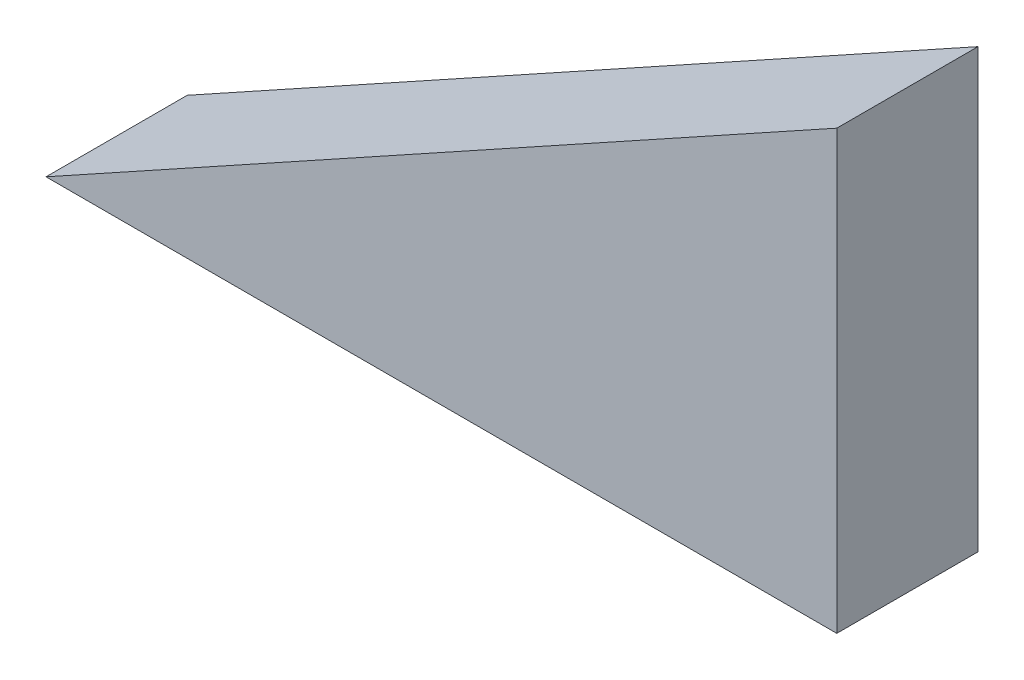
ISO-10303-21;
HEADER;
FILE_DESCRIPTION(('STEP AP214'),'2;1');
FILE_NAME('part.step','',(''),(''),'','','');
FILE_SCHEMA(('AUTOMOTIVE_DESIGN { 1 0 10303 214 1 1 1 1 }'));
ENDSEC;
DATA;
#1=APPLICATION_CONTEXT('core data for automotive mechanical design processes');
#2=APPLICATION_PROTOCOL_DEFINITION('international standard','automotive_design',2000,#1);
#3=PRODUCT_CONTEXT('',#1,'mechanical');
#4=PRODUCT('Part','Part','',(#3));
#5=PRODUCT_RELATED_PRODUCT_CATEGORY('part','',(#4));
#6=PRODUCT_DEFINITION_FORMATION('','',#4);
#7=PRODUCT_DEFINITION_CONTEXT('part definition',#1,'design');
#8=PRODUCT_DEFINITION('design','',#6,#7);
#9=PRODUCT_DEFINITION_SHAPE('','',#8);
#10=(LENGTH_UNIT() NAMED_UNIT(*) SI_UNIT(.MILLI.,.METRE.));
#11=(NAMED_UNIT(*) PLANE_ANGLE_UNIT() SI_UNIT($,.RADIAN.));
#12=(NAMED_UNIT(*) SI_UNIT($,.STERADIAN.) SOLID_ANGLE_UNIT());
#13=UNCERTAINTY_MEASURE_WITH_UNIT(LENGTH_MEASURE(1.E-05),#10,'distance_accuracy_value','');
#14=(GEOMETRIC_REPRESENTATION_CONTEXT(3) GLOBAL_UNCERTAINTY_ASSIGNED_CONTEXT((#13)) GLOBAL_UNIT_ASSIGNED_CONTEXT((#10,
#11,#12)) REPRESENTATION_CONTEXT('',''));
#15=CARTESIAN_POINT('',(0.,0.,0.));
#16=DIRECTION('',(0.,0.,1.));
#17=DIRECTION('',(1.,0.,0.));
#18=AXIS2_PLACEMENT_3D('',#15,#16,#17);
#19=CARTESIAN_POINT('',(28.,15.4919333848297,5.));
#20=DIRECTION('',(0.484122918275927,-0.875,0.));
#21=DIRECTION('',(0.875,0.484122918275927,0.));
#22=AXIS2_PLACEMENT_3D('',#19,#20,#21);
#23=PLANE('',#22);
#24=DIRECTION('',(-0.875,-0.484122918275927,0.));
#25=VECTOR('',#24,1.);
#26=CARTESIAN_POINT('',(28.,15.4919333848297,0.));
#27=LINE('',#26,#25);
#28=CARTESIAN_POINT('',(28.,15.4919333848297,0.));
#29=VERTEX_POINT('',#28);
#30=CARTESIAN_POINT('',(0.,0.,0.));
#31=VERTEX_POINT('',#30);
#32=EDGE_CURVE('E89',#29,#31,#27,.T.);
#33=ORIENTED_EDGE('',*,*,#32,.T.);
#34=DIRECTION('',(0.,0.,-1.));
#35=VECTOR('',#34,1.);
#36=CARTESIAN_POINT('',(0.,0.,5.));
#37=LINE('',#36,#35);
#38=CARTESIAN_POINT('',(0.,0.,5.));
#39=VERTEX_POINT('',#38);
#40=EDGE_CURVE('E11',#39,#31,#37,.T.);
#41=ORIENTED_EDGE('',*,*,#40,.F.);
#42=DIRECTION('',(-0.875,-0.484122918275927,0.));
#43=VECTOR('',#42,1.);
#44=CARTESIAN_POINT('',(28.,15.4919333848297,5.));
#45=LINE('',#44,#43);
#46=CARTESIAN_POINT('',(28.,15.4919333848297,5.));
#47=VERTEX_POINT('',#46);
#48=EDGE_CURVE('E81',#47,#39,#45,.T.);
#49=ORIENTED_EDGE('',*,*,#48,.F.);
#50=DIRECTION('',(0.,0.,-1.));
#51=VECTOR('',#50,1.);
#52=CARTESIAN_POINT('',(28.,15.4919333848297,5.));
#53=LINE('',#52,#51);
#54=EDGE_CURVE('E90',#47,#29,#53,.T.);
#55=ORIENTED_EDGE('',*,*,#54,.T.);
#56=EDGE_LOOP('',(#33,#41,#49,#55));
#57=FACE_BOUND('',#56,.T.);
#58=ADVANCED_FACE('F39',(#57),#23,.F.);
#59=CARTESIAN_POINT('',(0.,0.,5.));
#60=DIRECTION('',(0.,1.,0.));
#61=DIRECTION('',(0.,0.,1.));
#62=AXIS2_PLACEMENT_3D('',#59,#60,#61);
#63=PLANE('',#62);
#64=DIRECTION('',(1.,0.,0.));
#65=VECTOR('',#64,1.);
#66=CARTESIAN_POINT('',(0.,0.,0.));
#67=LINE('',#66,#65);
#68=CARTESIAN_POINT('',(28.,0.,0.));
#69=VERTEX_POINT('',#68);
#70=EDGE_CURVE('E68',#31,#69,#67,.T.);
#71=ORIENTED_EDGE('',*,*,#70,.T.);
#72=DIRECTION('',(0.,0.,-1.));
#73=VECTOR('',#72,1.);
#74=CARTESIAN_POINT('',(28.,0.,5.));
#75=LINE('',#74,#73);
#76=CARTESIAN_POINT('',(28.,0.,5.));
#77=VERTEX_POINT('',#76);
#78=EDGE_CURVE('E48',#77,#69,#75,.T.);
#79=ORIENTED_EDGE('',*,*,#78,.F.);
#80=DIRECTION('',(1.,0.,0.));
#81=VECTOR('',#80,1.);
#82=CARTESIAN_POINT('',(0.,0.,5.));
#83=LINE('',#82,#81);
#84=EDGE_CURVE('E76',#39,#77,#83,.T.);
#85=ORIENTED_EDGE('',*,*,#84,.F.);
#86=ORIENTED_EDGE('',*,*,#40,.T.);
#87=EDGE_LOOP('',(#71,#79,#85,#86));
#88=FACE_BOUND('',#87,.T.);
#89=ADVANCED_FACE('F77',(#88),#63,.F.);
#90=CARTESIAN_POINT('',(28.,0.,5.));
#91=DIRECTION('',(-1.,0.,0.));
#92=DIRECTION('',(0.,0.,1.));
#93=AXIS2_PLACEMENT_3D('',#90,#91,#92);
#94=PLANE('',#93);
#95=DIRECTION('',(0.,1.,0.));
#96=VECTOR('',#95,1.);
#97=CARTESIAN_POINT('',(28.,0.,0.));
#98=LINE('',#97,#96);
#99=EDGE_CURVE('E73',#69,#29,#98,.T.);
#100=ORIENTED_EDGE('',*,*,#99,.T.);
#101=ORIENTED_EDGE('',*,*,#54,.F.);
#102=DIRECTION('',(0.,1.,0.));
#103=VECTOR('',#102,1.);
#104=CARTESIAN_POINT('',(28.,0.,5.));
#105=LINE('',#104,#103);
#106=EDGE_CURVE('E56',#77,#47,#105,.T.);
#107=ORIENTED_EDGE('',*,*,#106,.F.);
#108=ORIENTED_EDGE('',*,*,#78,.T.);
#109=EDGE_LOOP('',(#100,#101,#107,#108));
#110=FACE_BOUND('',#109,.T.);
#111=ADVANCED_FACE('F102',(#110),#94,.F.);
#112=CARTESIAN_POINT('',(0.,0.,5.));
#113=DIRECTION('',(0.,0.,-1.));
#114=DIRECTION('',(-1.,0.,0.));
#115=AXIS2_PLACEMENT_3D('',#112,#113,#114);
#116=PLANE('',#115);
#117=ORIENTED_EDGE('',*,*,#48,.T.);
#118=ORIENTED_EDGE('',*,*,#84,.T.);
#119=ORIENTED_EDGE('',*,*,#106,.T.);
#120=EDGE_LOOP('',(#117,#118,#119));
#121=FACE_BOUND('',#120,.T.);
#122=ADVANCED_FACE('F84',(#121),#116,.F.);
#123=CARTESIAN_POINT('',(0.,0.,0.));
#124=DIRECTION('',(0.,0.,-1.));
#125=DIRECTION('',(-1.,0.,0.));
#126=AXIS2_PLACEMENT_3D('',#123,#124,#125);
#127=PLANE('',#126);
#128=ORIENTED_EDGE('',*,*,#32,.F.);
#129=ORIENTED_EDGE('',*,*,#99,.F.);
#130=ORIENTED_EDGE('',*,*,#70,.F.);
#131=EDGE_LOOP('',(#128,#129,#130));
#132=FACE_BOUND('',#131,.T.);
#133=ADVANCED_FACE('F103',(#132),#127,.T.);
#134=CLOSED_SHELL('',(#58,#89,#111,#122,#133));
#135=MANIFOLD_SOLID_BREP('B2',#134);
#136=ADVANCED_BREP_SHAPE_REPRESENTATION('',(#18,#135),#14);
#137=SHAPE_DEFINITION_REPRESENTATION(#9,#136);
ENDSEC;
END-ISO-10303-21;
